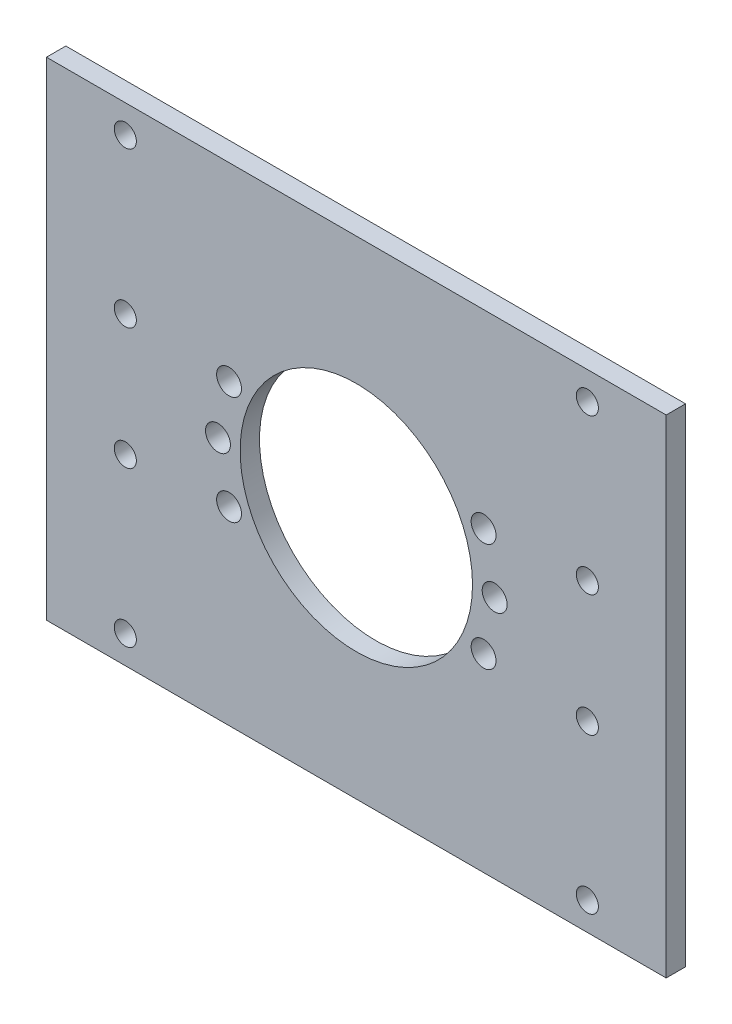
ISO-10303-21;
HEADER;
FILE_DESCRIPTION(('STEP AP214'),'2;1');
FILE_NAME('part.step','',(''),(''),'','','');
FILE_SCHEMA(('AUTOMOTIVE_DESIGN { 1 0 10303 214 1 1 1 1 }'));
ENDSEC;
DATA;
#1=APPLICATION_CONTEXT('core data for automotive mechanical design processes');
#2=APPLICATION_PROTOCOL_DEFINITION('international standard','automotive_design',2000,#1);
#3=PRODUCT_CONTEXT('',#1,'mechanical');
#4=PRODUCT('Part','Part','',(#3));
#5=PRODUCT_RELATED_PRODUCT_CATEGORY('part','',(#4));
#6=PRODUCT_DEFINITION_FORMATION('','',#4);
#7=PRODUCT_DEFINITION_CONTEXT('part definition',#1,'design');
#8=PRODUCT_DEFINITION('design','',#6,#7);
#9=PRODUCT_DEFINITION_SHAPE('','',#8);
#10=(LENGTH_UNIT() NAMED_UNIT(*) SI_UNIT(.MILLI.,.METRE.));
#11=(NAMED_UNIT(*) PLANE_ANGLE_UNIT() SI_UNIT($,.RADIAN.));
#12=(NAMED_UNIT(*) SI_UNIT($,.STERADIAN.) SOLID_ANGLE_UNIT());
#13=UNCERTAINTY_MEASURE_WITH_UNIT(LENGTH_MEASURE(1.E-05),#10,'distance_accuracy_value','');
#14=(GEOMETRIC_REPRESENTATION_CONTEXT(3) GLOBAL_UNCERTAINTY_ASSIGNED_CONTEXT((#13)) GLOBAL_UNIT_ASSIGNED_CONTEXT((#10,
#11,#12)) REPRESENTATION_CONTEXT('',''));
#15=CARTESIAN_POINT('',(0.,0.,0.));
#16=DIRECTION('',(0.,0.,1.));
#17=DIRECTION('',(1.,0.,0.));
#18=AXIS2_PLACEMENT_3D('',#15,#16,#17);
#19=CARTESIAN_POINT('',(-56.,0.,3.5));
#20=DIRECTION('',(-1.,0.,0.));
#21=DIRECTION('',(0.,0.,1.));
#22=AXIS2_PLACEMENT_3D('',#19,#20,#21);
#23=PLANE('',#22);
#24=DIRECTION('',(0.,1.,0.));
#25=VECTOR('',#24,1.);
#26=CARTESIAN_POINT('',(-56.,0.,0.));
#27=LINE('',#26,#25);
#28=CARTESIAN_POINT('',(-56.,-44.06,0.));
#29=VERTEX_POINT('',#28);
#30=CARTESIAN_POINT('',(-56.,44.06,0.));
#31=VERTEX_POINT('',#30);
#32=EDGE_CURVE('E120',#29,#31,#27,.T.);
#33=ORIENTED_EDGE('',*,*,#32,.F.);
#34=DIRECTION('',(0.,0.,-1.));
#35=VECTOR('',#34,1.);
#36=CARTESIAN_POINT('',(-56.,-44.06,3.5));
#37=LINE('',#36,#35);
#38=CARTESIAN_POINT('',(-56.,-44.06,3.5));
#39=VERTEX_POINT('',#38);
#40=EDGE_CURVE('E11',#39,#29,#37,.T.);
#41=ORIENTED_EDGE('',*,*,#40,.F.);
#42=DIRECTION('',(0.,1.,0.));
#43=VECTOR('',#42,1.);
#44=CARTESIAN_POINT('',(-56.,0.,3.5));
#45=LINE('',#44,#43);
#46=CARTESIAN_POINT('',(-56.,44.06,3.5));
#47=VERTEX_POINT('',#46);
#48=EDGE_CURVE('E91',#39,#47,#45,.T.);
#49=ORIENTED_EDGE('',*,*,#48,.T.);
#50=DIRECTION('',(0.,0.,-1.));
#51=VECTOR('',#50,1.);
#52=CARTESIAN_POINT('',(-56.,44.06,3.5));
#53=LINE('',#52,#51);
#54=EDGE_CURVE('E52',#47,#31,#53,.T.);
#55=ORIENTED_EDGE('',*,*,#54,.T.);
#56=EDGE_LOOP('',(#33,#41,#49,#55));
#57=FACE_BOUND('',#56,.T.);
#58=ADVANCED_FACE('F35',(#57),#23,.T.);
#59=CARTESIAN_POINT('',(0.,-44.06,3.5));
#60=DIRECTION('',(0.,1.,0.));
#61=DIRECTION('',(-1.,0.,0.));
#62=AXIS2_PLACEMENT_3D('',#59,#60,#61);
#63=PLANE('',#62);
#64=DIRECTION('',(1.,0.,0.));
#65=VECTOR('',#64,1.);
#66=CARTESIAN_POINT('',(0.,-44.06,0.));
#67=LINE('',#66,#65);
#68=CARTESIAN_POINT('',(56.,-44.06,0.));
#69=VERTEX_POINT('',#68);
#70=EDGE_CURVE('E96',#29,#69,#67,.T.);
#71=ORIENTED_EDGE('',*,*,#70,.T.);
#72=DIRECTION('',(0.,0.,-1.));
#73=VECTOR('',#72,1.);
#74=CARTESIAN_POINT('',(56.,-44.06,3.5));
#75=LINE('',#74,#73);
#76=CARTESIAN_POINT('',(56.,-44.06,3.5));
#77=VERTEX_POINT('',#76);
#78=EDGE_CURVE('E44',#77,#69,#75,.T.);
#79=ORIENTED_EDGE('',*,*,#78,.F.);
#80=DIRECTION('',(1.,0.,0.));
#81=VECTOR('',#80,1.);
#82=CARTESIAN_POINT('',(0.,-44.06,3.5));
#83=LINE('',#82,#81);
#84=EDGE_CURVE('E86',#39,#77,#83,.T.);
#85=ORIENTED_EDGE('',*,*,#84,.F.);
#86=ORIENTED_EDGE('',*,*,#40,.T.);
#87=EDGE_LOOP('',(#71,#79,#85,#86));
#88=FACE_BOUND('',#87,.T.);
#89=ADVANCED_FACE('F94',(#88),#63,.F.);
#90=CARTESIAN_POINT('',(56.,0.,3.5));
#91=DIRECTION('',(-1.,0.,0.));
#92=DIRECTION('',(0.,0.,1.));
#93=AXIS2_PLACEMENT_3D('',#90,#91,#92);
#94=PLANE('',#93);
#95=DIRECTION('',(0.,1.,0.));
#96=VECTOR('',#95,1.);
#97=CARTESIAN_POINT('',(56.,0.,0.));
#98=LINE('',#97,#96);
#99=CARTESIAN_POINT('',(56.,44.06,0.));
#100=VERTEX_POINT('',#99);
#101=EDGE_CURVE('E117',#69,#100,#98,.T.);
#102=ORIENTED_EDGE('',*,*,#101,.T.);
#103=DIRECTION('',(0.,0.,-1.));
#104=VECTOR('',#103,1.);
#105=CARTESIAN_POINT('',(56.,44.06,3.5));
#106=LINE('',#105,#104);
#107=CARTESIAN_POINT('',(56.,44.06,3.5));
#108=VERTEX_POINT('',#107);
#109=EDGE_CURVE('E66',#108,#100,#106,.T.);
#110=ORIENTED_EDGE('',*,*,#109,.F.);
#111=DIRECTION('',(0.,1.,0.));
#112=VECTOR('',#111,1.);
#113=CARTESIAN_POINT('',(56.,0.,3.5));
#114=LINE('',#113,#112);
#115=EDGE_CURVE('E78',#77,#108,#114,.T.);
#116=ORIENTED_EDGE('',*,*,#115,.F.);
#117=ORIENTED_EDGE('',*,*,#78,.T.);
#118=EDGE_LOOP('',(#102,#110,#116,#117));
#119=FACE_BOUND('',#118,.T.);
#120=ADVANCED_FACE('F80',(#119),#94,.F.);
#121=CARTESIAN_POINT('',(23.,-9.79795897113271,3.5));
#122=DIRECTION('',(0.,0.,-1.));
#123=DIRECTION('',(-1.,0.,0.));
#124=AXIS2_PLACEMENT_3D('',#121,#122,#123);
#125=CYLINDRICAL_SURFACE('',#124,2.25);
#126=CARTESIAN_POINT('',(23.,-9.79795897113271,3.5));
#127=DIRECTION('',(0.,0.,1.));
#128=DIRECTION('',(1.,0.,0.));
#129=AXIS2_PLACEMENT_3D('',#126,#127,#128);
#130=CIRCLE('',#129,2.25);
#131=CARTESIAN_POINT('',(25.25,-9.79795897113271,3.5));
#132=VERTEX_POINT('',#131);
#133=EDGE_CURVE('E134',#132,#132,#130,.F.);
#134=ORIENTED_EDGE('',*,*,#133,.F.);
#135=EDGE_LOOP('',(#134));
#136=FACE_BOUND('',#135,.T.);
#137=CARTESIAN_POINT('',(23.,-9.79795897113271,0.));
#138=DIRECTION('',(0.,0.,1.));
#139=DIRECTION('',(1.,0.,0.));
#140=AXIS2_PLACEMENT_3D('',#137,#138,#139);
#141=CIRCLE('',#140,2.25);
#142=CARTESIAN_POINT('',(25.25,-9.79795897113271,0.));
#143=VERTEX_POINT('',#142);
#144=EDGE_CURVE('E105',#143,#143,#141,.F.);
#145=ORIENTED_EDGE('',*,*,#144,.T.);
#146=EDGE_LOOP('',(#145));
#147=FACE_BOUND('',#146,.T.);
#148=ADVANCED_FACE('F443',(#136,#147),#125,.F.);
#149=CARTESIAN_POINT('',(25.,0.,3.5));
#150=DIRECTION('',(0.,0.,-1.));
#151=DIRECTION('',(-1.,0.,0.));
#152=AXIS2_PLACEMENT_3D('',#149,#150,#151);
#153=CYLINDRICAL_SURFACE('',#152,2.25);
#154=CARTESIAN_POINT('',(25.,0.,3.5));
#155=DIRECTION('',(0.,0.,1.));
#156=DIRECTION('',(1.,0.,0.));
#157=AXIS2_PLACEMENT_3D('',#154,#155,#156);
#158=CIRCLE('',#157,2.25);
#159=CARTESIAN_POINT('',(27.25,0.,3.5));
#160=VERTEX_POINT('',#159);
#161=EDGE_CURVE('E137',#160,#160,#158,.T.);
#162=ORIENTED_EDGE('',*,*,#161,.T.);
#163=EDGE_LOOP('',(#162));
#164=FACE_BOUND('',#163,.T.);
#165=CARTESIAN_POINT('',(25.,0.,0.));
#166=DIRECTION('',(0.,0.,1.));
#167=DIRECTION('',(1.,0.,0.));
#168=AXIS2_PLACEMENT_3D('',#165,#166,#167);
#169=CIRCLE('',#168,2.25);
#170=CARTESIAN_POINT('',(27.25,0.,0.));
#171=VERTEX_POINT('',#170);
#172=EDGE_CURVE('E108',#171,#171,#169,.T.);
#173=ORIENTED_EDGE('',*,*,#172,.F.);
#174=EDGE_LOOP('',(#173));
#175=FACE_BOUND('',#174,.T.);
#176=ADVANCED_FACE('F434',(#164,#175),#153,.F.);
#177=CARTESIAN_POINT('',(0.,0.,3.5));
#178=DIRECTION('',(0.,0.,-1.));
#179=DIRECTION('',(-1.,0.,0.));
#180=AXIS2_PLACEMENT_3D('',#177,#178,#179);
#181=CYLINDRICAL_SURFACE('',#180,21.);
#182=CARTESIAN_POINT('',(0.,0.,3.5));
#183=DIRECTION('',(0.,0.,1.));
#184=DIRECTION('',(1.,0.,0.));
#185=AXIS2_PLACEMENT_3D('',#182,#183,#184);
#186=CIRCLE('',#185,21.);
#187=CARTESIAN_POINT('',(21.,0.,3.5));
#188=VERTEX_POINT('',#187);
#189=EDGE_CURVE('E140',#188,#188,#186,.T.);
#190=ORIENTED_EDGE('',*,*,#189,.T.);
#191=EDGE_LOOP('',(#190));
#192=FACE_BOUND('',#191,.T.);
#193=CARTESIAN_POINT('',(0.,0.,0.));
#194=DIRECTION('',(0.,0.,1.));
#195=DIRECTION('',(1.,0.,0.));
#196=AXIS2_PLACEMENT_3D('',#193,#194,#195);
#197=CIRCLE('',#196,21.);
#198=CARTESIAN_POINT('',(21.,0.,0.));
#199=VERTEX_POINT('',#198);
#200=EDGE_CURVE('E111',#199,#199,#197,.T.);
#201=ORIENTED_EDGE('',*,*,#200,.F.);
#202=EDGE_LOOP('',(#201));
#203=FACE_BOUND('',#202,.T.);
#204=ADVANCED_FACE('F426',(#192,#203),#181,.F.);
#205=CARTESIAN_POINT('',(0.,44.06,3.5));
#206=DIRECTION('',(0.,1.,0.));
#207=DIRECTION('',(0.,0.,1.));
#208=AXIS2_PLACEMENT_3D('',#205,#206,#207);
#209=PLANE('',#208);
#210=DIRECTION('',(1.,0.,0.));
#211=VECTOR('',#210,1.);
#212=CARTESIAN_POINT('',(0.,44.06,0.));
#213=LINE('',#212,#211);
#214=EDGE_CURVE('E114',#31,#100,#213,.T.);
#215=ORIENTED_EDGE('',*,*,#214,.F.);
#216=ORIENTED_EDGE('',*,*,#54,.F.);
#217=DIRECTION('',(1.,0.,0.));
#218=VECTOR('',#217,1.);
#219=CARTESIAN_POINT('',(0.,44.06,3.5));
#220=LINE('',#219,#218);
#221=EDGE_CURVE('E85',#47,#108,#220,.T.);
#222=ORIENTED_EDGE('',*,*,#221,.T.);
#223=ORIENTED_EDGE('',*,*,#109,.T.);
#224=EDGE_LOOP('',(#215,#216,#222,#223));
#225=FACE_BOUND('',#224,.T.);
#226=ADVANCED_FACE('F239',(#225),#209,.T.);
#227=CARTESIAN_POINT('',(-23.,9.79795897113272,3.5));
#228=DIRECTION('',(0.,0.,-1.));
#229=DIRECTION('',(-1.,0.,0.));
#230=AXIS2_PLACEMENT_3D('',#227,#228,#229);
#231=CYLINDRICAL_SURFACE('',#230,2.25);
#232=CARTESIAN_POINT('',(-23.,9.79795897113272,3.5));
#233=DIRECTION('',(0.,0.,1.));
#234=DIRECTION('',(1.,0.,0.));
#235=AXIS2_PLACEMENT_3D('',#232,#233,#234);
#236=CIRCLE('',#235,2.25);
#237=CARTESIAN_POINT('',(-20.75,9.79795897113272,3.5));
#238=VERTEX_POINT('',#237);
#239=EDGE_CURVE('E145',#238,#238,#236,.F.);
#240=ORIENTED_EDGE('',*,*,#239,.F.);
#241=EDGE_LOOP('',(#240));
#242=FACE_BOUND('',#241,.T.);
#243=CARTESIAN_POINT('',(-23.,9.79795897113272,0.));
#244=DIRECTION('',(0.,0.,1.));
#245=DIRECTION('',(1.,0.,0.));
#246=AXIS2_PLACEMENT_3D('',#243,#244,#245);
#247=CIRCLE('',#246,2.25);
#248=CARTESIAN_POINT('',(-20.75,9.79795897113272,0.));
#249=VERTEX_POINT('',#248);
#250=EDGE_CURVE('E122',#249,#249,#247,.F.);
#251=ORIENTED_EDGE('',*,*,#250,.T.);
#252=EDGE_LOOP('',(#251));
#253=FACE_BOUND('',#252,.T.);
#254=ADVANCED_FACE('F235',(#242,#253),#231,.F.);
#255=CARTESIAN_POINT('',(-23.,-9.7979589711327,3.5));
#256=DIRECTION('',(0.,0.,-1.));
#257=DIRECTION('',(-1.,0.,0.));
#258=AXIS2_PLACEMENT_3D('',#255,#256,#257);
#259=CYLINDRICAL_SURFACE('',#258,2.25);
#260=CARTESIAN_POINT('',(-23.,-9.7979589711327,3.5));
#261=DIRECTION('',(0.,0.,1.));
#262=DIRECTION('',(1.,0.,0.));
#263=AXIS2_PLACEMENT_3D('',#260,#261,#262);
#264=CIRCLE('',#263,2.25);
#265=CARTESIAN_POINT('',(-20.75,-9.7979589711327,3.5));
#266=VERTEX_POINT('',#265);
#267=EDGE_CURVE('E148',#266,#266,#264,.T.);
#268=ORIENTED_EDGE('',*,*,#267,.T.);
#269=EDGE_LOOP('',(#268));
#270=FACE_BOUND('',#269,.T.);
#271=CARTESIAN_POINT('',(-23.,-9.7979589711327,0.));
#272=DIRECTION('',(0.,0.,1.));
#273=DIRECTION('',(1.,0.,0.));
#274=AXIS2_PLACEMENT_3D('',#271,#272,#273);
#275=CIRCLE('',#274,2.25);
#276=CARTESIAN_POINT('',(-20.75,-9.7979589711327,0.));
#277=VERTEX_POINT('',#276);
#278=EDGE_CURVE('E125',#277,#277,#275,.T.);
#279=ORIENTED_EDGE('',*,*,#278,.F.);
#280=EDGE_LOOP('',(#279));
#281=FACE_BOUND('',#280,.T.);
#282=ADVANCED_FACE('F238',(#270,#281),#259,.F.);
#283=CARTESIAN_POINT('',(23.,9.79795897113271,3.5));
#284=DIRECTION('',(0.,0.,-1.));
#285=DIRECTION('',(-1.,0.,0.));
#286=AXIS2_PLACEMENT_3D('',#283,#284,#285);
#287=CYLINDRICAL_SURFACE('',#286,2.25);
#288=CARTESIAN_POINT('',(23.,9.79795897113271,3.5));
#289=DIRECTION('',(0.,0.,1.));
#290=DIRECTION('',(1.,0.,0.));
#291=AXIS2_PLACEMENT_3D('',#288,#289,#290);
#292=CIRCLE('',#291,2.25);
#293=CARTESIAN_POINT('',(25.25,9.79795897113271,3.5));
#294=VERTEX_POINT('',#293);
#295=EDGE_CURVE('E104',#294,#294,#292,.T.);
#296=ORIENTED_EDGE('',*,*,#295,.T.);
#297=EDGE_LOOP('',(#296));
#298=FACE_BOUND('',#297,.T.);
#299=CARTESIAN_POINT('',(23.,9.79795897113271,0.));
#300=DIRECTION('',(0.,0.,1.));
#301=DIRECTION('',(1.,0.,0.));
#302=AXIS2_PLACEMENT_3D('',#299,#300,#301);
#303=CIRCLE('',#302,2.25);
#304=CARTESIAN_POINT('',(25.25,9.79795897113271,0.));
#305=VERTEX_POINT('',#304);
#306=EDGE_CURVE('E128',#305,#305,#303,.T.);
#307=ORIENTED_EDGE('',*,*,#306,.F.);
#308=EDGE_LOOP('',(#307));
#309=FACE_BOUND('',#308,.T.);
#310=ADVANCED_FACE('F37',(#298,#309),#287,.F.);
#311=CARTESIAN_POINT('',(-25.,0.,3.5));
#312=DIRECTION('',(0.,0.,-1.));
#313=DIRECTION('',(-1.,0.,0.));
#314=AXIS2_PLACEMENT_3D('',#311,#312,#313);
#315=CYLINDRICAL_SURFACE('',#314,2.25);
#316=CARTESIAN_POINT('',(-25.,0.,3.5));
#317=DIRECTION('',(0.,0.,1.));
#318=DIRECTION('',(1.,0.,0.));
#319=AXIS2_PLACEMENT_3D('',#316,#317,#318);
#320=CIRCLE('',#319,2.25);
#321=CARTESIAN_POINT('',(-22.75,0.,3.5));
#322=VERTEX_POINT('',#321);
#323=EDGE_CURVE('E100',#322,#322,#320,.F.);
#324=ORIENTED_EDGE('',*,*,#323,.F.);
#325=EDGE_LOOP('',(#324));
#326=FACE_BOUND('',#325,.T.);
#327=CARTESIAN_POINT('',(-25.,0.,0.));
#328=DIRECTION('',(0.,0.,1.));
#329=DIRECTION('',(1.,0.,0.));
#330=AXIS2_PLACEMENT_3D('',#327,#328,#329);
#331=CIRCLE('',#330,2.25);
#332=CARTESIAN_POINT('',(-22.75,0.,0.));
#333=VERTEX_POINT('',#332);
#334=EDGE_CURVE('E101',#333,#333,#331,.F.);
#335=ORIENTED_EDGE('',*,*,#334,.T.);
#336=EDGE_LOOP('',(#335));
#337=FACE_BOUND('',#336,.T.);
#338=ADVANCED_FACE('F213',(#326,#337),#315,.F.);
#339=CARTESIAN_POINT('',(0.,0.,3.5));
#340=DIRECTION('',(0.,0.,1.));
#341=DIRECTION('',(1.,0.,0.));
#342=AXIS2_PLACEMENT_3D('',#339,#340,#341);
#343=PLANE('',#342);
#344=CARTESIAN_POINT('',(-41.7499999517118,-10.9978220350817,3.5));
#345=DIRECTION('',(0.,0.,1.));
#346=DIRECTION('',(1.,0.,0.));
#347=AXIS2_PLACEMENT_3D('',#344,#345,#346);
#348=CIRCLE('',#347,1.99784914999465);
#349=CARTESIAN_POINT('',(-39.7521508017171,-10.9978220350817,3.5));
#350=VERTEX_POINT('',#349);
#351=EDGE_CURVE('E195',#350,#350,#348,.T.);
#352=ORIENTED_EDGE('',*,*,#351,.F.);
#353=EDGE_LOOP('',(#352));
#354=FACE_BOUND('',#353,.T.);
#355=CARTESIAN_POINT('',(-41.7499998567938,-38.9978219593871,3.5));
#356=DIRECTION('',(0.,0.,1.));
#357=DIRECTION('',(1.,0.,0.));
#358=AXIS2_PLACEMENT_3D('',#355,#356,#357);
#359=CIRCLE('',#358,1.99784904061286);
#360=CARTESIAN_POINT('',(-39.7521508161809,-38.9978219593871,3.5));
#361=VERTEX_POINT('',#360);
#362=EDGE_CURVE('E189',#361,#361,#359,.T.);
#363=ORIENTED_EDGE('',*,*,#362,.F.);
#364=EDGE_LOOP('',(#363));
#365=FACE_BOUND('',#364,.T.);
#366=CARTESIAN_POINT('',(41.75,-38.9978220034269,3.5));
#367=DIRECTION('',(0.,0.,1.));
#368=DIRECTION('',(1.,0.,0.));
#369=AXIS2_PLACEMENT_3D('',#366,#367,#368);
#370=CIRCLE('',#369,1.9978491362511);
#371=CARTESIAN_POINT('',(43.7478491362511,-38.9978220034269,3.5));
#372=VERTEX_POINT('',#371);
#373=EDGE_CURVE('E183',#372,#372,#370,.T.);
#374=ORIENTED_EDGE('',*,*,#373,.F.);
#375=EDGE_LOOP('',(#374));
#376=FACE_BOUND('',#375,.T.);
#377=CARTESIAN_POINT('',(41.75,-10.9978220034269,3.5));
#378=DIRECTION('',(0.,0.,1.));
#379=DIRECTION('',(1.,0.,0.));
#380=AXIS2_PLACEMENT_3D('',#377,#378,#379);
#381=CIRCLE('',#380,1.9978491362511);
#382=CARTESIAN_POINT('',(43.7478491362511,-10.9978220034269,3.5));
#383=VERTEX_POINT('',#382);
#384=EDGE_CURVE('E177',#383,#383,#381,.T.);
#385=ORIENTED_EDGE('',*,*,#384,.F.);
#386=EDGE_LOOP('',(#385));
#387=FACE_BOUND('',#386,.T.);
#388=CARTESIAN_POINT('',(41.7500000334165,10.9978219957998,3.5));
#389=DIRECTION('',(0.,0.,1.));
#390=DIRECTION('',(1.,0.,0.));
#391=AXIS2_PLACEMENT_3D('',#388,#389,#390);
#392=CIRCLE('',#391,1.99784915762175);
#393=CARTESIAN_POINT('',(43.7478491910383,10.9978219957998,3.5));
#394=VERTEX_POINT('',#393);
#395=EDGE_CURVE('E171',#394,#394,#392,.T.);
#396=ORIENTED_EDGE('',*,*,#395,.F.);
#397=EDGE_LOOP('',(#396));
#398=FACE_BOUND('',#397,.T.);
#399=CARTESIAN_POINT('',(-41.7499999665835,39.0021779957998,3.5));
#400=DIRECTION('',(0.,0.,1.));
#401=DIRECTION('',(1.,0.,0.));
#402=AXIS2_PLACEMENT_3D('',#399,#400,#401);
#403=CIRCLE('',#402,1.99784915762175);
#404=CARTESIAN_POINT('',(-39.7521508089618,39.0021779957998,3.5));
#405=VERTEX_POINT('',#404);
#406=EDGE_CURVE('E165',#405,#405,#403,.T.);
#407=ORIENTED_EDGE('',*,*,#406,.F.);
#408=EDGE_LOOP('',(#407));
#409=FACE_BOUND('',#408,.T.);
#410=CARTESIAN_POINT('',(41.7500000334165,38.9978219957998,3.5));
#411=DIRECTION('',(0.,0.,1.));
#412=DIRECTION('',(1.,0.,0.));
#413=AXIS2_PLACEMENT_3D('',#410,#411,#412);
#414=CIRCLE('',#413,1.99784915762175);
#415=CARTESIAN_POINT('',(43.7478491910383,38.9978219957998,3.5));
#416=VERTEX_POINT('',#415);
#417=EDGE_CURVE('E159',#416,#416,#414,.T.);
#418=ORIENTED_EDGE('',*,*,#417,.F.);
#419=EDGE_LOOP('',(#418));
#420=FACE_BOUND('',#419,.T.);
#421=CARTESIAN_POINT('',(-41.7499999665835,11.0021779957998,3.5));
#422=DIRECTION('',(0.,0.,1.));
#423=DIRECTION('',(1.,0.,0.));
#424=AXIS2_PLACEMENT_3D('',#421,#422,#423);
#425=CIRCLE('',#424,1.99784915762175);
#426=CARTESIAN_POINT('',(-39.7521508089618,11.0021779957998,3.5));
#427=VERTEX_POINT('',#426);
#428=EDGE_CURVE('E153',#427,#427,#425,.T.);
#429=ORIENTED_EDGE('',*,*,#428,.F.);
#430=EDGE_LOOP('',(#429));
#431=FACE_BOUND('',#430,.T.);
#432=ORIENTED_EDGE('',*,*,#295,.F.);
#433=EDGE_LOOP('',(#432));
#434=FACE_BOUND('',#433,.T.);
#435=ORIENTED_EDGE('',*,*,#267,.F.);
#436=EDGE_LOOP('',(#435));
#437=FACE_BOUND('',#436,.T.);
#438=ORIENTED_EDGE('',*,*,#239,.T.);
#439=EDGE_LOOP('',(#438));
#440=FACE_BOUND('',#439,.T.);
#441=ORIENTED_EDGE('',*,*,#48,.F.);
#442=ORIENTED_EDGE('',*,*,#84,.T.);
#443=ORIENTED_EDGE('',*,*,#115,.T.);
#444=ORIENTED_EDGE('',*,*,#221,.F.);
#445=EDGE_LOOP('',(#441,#442,#443,#444));
#446=FACE_BOUND('',#445,.T.);
#447=ORIENTED_EDGE('',*,*,#189,.F.);
#448=EDGE_LOOP('',(#447));
#449=FACE_BOUND('',#448,.T.);
#450=ORIENTED_EDGE('',*,*,#161,.F.);
#451=EDGE_LOOP('',(#450));
#452=FACE_BOUND('',#451,.T.);
#453=ORIENTED_EDGE('',*,*,#133,.T.);
#454=EDGE_LOOP('',(#453));
#455=FACE_BOUND('',#454,.T.);
#456=ORIENTED_EDGE('',*,*,#323,.T.);
#457=EDGE_LOOP('',(#456));
#458=FACE_BOUND('',#457,.T.);
#459=ADVANCED_FACE('F89',(#354,#365,#376,#387,#398,#409,#420,#431,#434,#437,#440,#446,#449,#452,
#455,#458),#343,.T.);
#460=CARTESIAN_POINT('',(0.,0.,0.));
#461=DIRECTION('',(0.,0.,1.));
#462=DIRECTION('',(1.,0.,0.));
#463=AXIS2_PLACEMENT_3D('',#460,#461,#462);
#464=PLANE('',#463);
#465=CARTESIAN_POINT('',(-41.7499999517118,-10.9978220350817,0.));
#466=DIRECTION('',(0.,0.,1.));
#467=DIRECTION('',(1.,0.,0.));
#468=AXIS2_PLACEMENT_3D('',#465,#466,#467);
#469=CIRCLE('',#468,1.99784914999465);
#470=CARTESIAN_POINT('',(-39.7521508017171,-10.9978220350817,0.));
#471=VERTEX_POINT('',#470);
#472=EDGE_CURVE('E192',#471,#471,#469,.T.);
#473=ORIENTED_EDGE('',*,*,#472,.T.);
#474=EDGE_LOOP('',(#473));
#475=FACE_BOUND('',#474,.T.);
#476=CARTESIAN_POINT('',(-41.7499998567938,-38.9978219593871,0.));
#477=DIRECTION('',(0.,0.,1.));
#478=DIRECTION('',(1.,0.,0.));
#479=AXIS2_PLACEMENT_3D('',#476,#477,#478);
#480=CIRCLE('',#479,1.99784904061286);
#481=CARTESIAN_POINT('',(-39.7521508161809,-38.9978219593871,0.));
#482=VERTEX_POINT('',#481);
#483=EDGE_CURVE('E186',#482,#482,#480,.T.);
#484=ORIENTED_EDGE('',*,*,#483,.T.);
#485=EDGE_LOOP('',(#484));
#486=FACE_BOUND('',#485,.T.);
#487=CARTESIAN_POINT('',(41.75,-38.9978220034269,0.));
#488=DIRECTION('',(0.,0.,1.));
#489=DIRECTION('',(1.,0.,0.));
#490=AXIS2_PLACEMENT_3D('',#487,#488,#489);
#491=CIRCLE('',#490,1.9978491362511);
#492=CARTESIAN_POINT('',(43.7478491362511,-38.9978220034269,0.));
#493=VERTEX_POINT('',#492);
#494=EDGE_CURVE('E180',#493,#493,#491,.T.);
#495=ORIENTED_EDGE('',*,*,#494,.T.);
#496=EDGE_LOOP('',(#495));
#497=FACE_BOUND('',#496,.T.);
#498=CARTESIAN_POINT('',(41.75,-10.9978220034269,0.));
#499=DIRECTION('',(0.,0.,1.));
#500=DIRECTION('',(1.,0.,0.));
#501=AXIS2_PLACEMENT_3D('',#498,#499,#500);
#502=CIRCLE('',#501,1.9978491362511);
#503=CARTESIAN_POINT('',(43.7478491362511,-10.9978220034269,0.));
#504=VERTEX_POINT('',#503);
#505=EDGE_CURVE('E174',#504,#504,#502,.T.);
#506=ORIENTED_EDGE('',*,*,#505,.T.);
#507=EDGE_LOOP('',(#506));
#508=FACE_BOUND('',#507,.T.);
#509=CARTESIAN_POINT('',(41.7500000334165,10.9978219957998,0.));
#510=DIRECTION('',(0.,0.,1.));
#511=DIRECTION('',(1.,0.,0.));
#512=AXIS2_PLACEMENT_3D('',#509,#510,#511);
#513=CIRCLE('',#512,1.99784915762175);
#514=CARTESIAN_POINT('',(43.7478491910383,10.9978219957998,0.));
#515=VERTEX_POINT('',#514);
#516=EDGE_CURVE('E168',#515,#515,#513,.T.);
#517=ORIENTED_EDGE('',*,*,#516,.T.);
#518=EDGE_LOOP('',(#517));
#519=FACE_BOUND('',#518,.T.);
#520=CARTESIAN_POINT('',(-41.7499999665835,39.0021779957998,0.));
#521=DIRECTION('',(0.,0.,1.));
#522=DIRECTION('',(1.,0.,0.));
#523=AXIS2_PLACEMENT_3D('',#520,#521,#522);
#524=CIRCLE('',#523,1.99784915762175);
#525=CARTESIAN_POINT('',(-39.7521508089618,39.0021779957998,0.));
#526=VERTEX_POINT('',#525);
#527=EDGE_CURVE('E162',#526,#526,#524,.T.);
#528=ORIENTED_EDGE('',*,*,#527,.T.);
#529=EDGE_LOOP('',(#528));
#530=FACE_BOUND('',#529,.T.);
#531=CARTESIAN_POINT('',(41.7500000334165,38.9978219957998,0.));
#532=DIRECTION('',(0.,0.,1.));
#533=DIRECTION('',(1.,0.,0.));
#534=AXIS2_PLACEMENT_3D('',#531,#532,#533);
#535=CIRCLE('',#534,1.99784915762175);
#536=CARTESIAN_POINT('',(43.7478491910383,38.9978219957998,0.));
#537=VERTEX_POINT('',#536);
#538=EDGE_CURVE('E156',#537,#537,#535,.T.);
#539=ORIENTED_EDGE('',*,*,#538,.T.);
#540=EDGE_LOOP('',(#539));
#541=FACE_BOUND('',#540,.T.);
#542=CARTESIAN_POINT('',(-41.7499999665835,11.0021779957998,0.));
#543=DIRECTION('',(0.,0.,1.));
#544=DIRECTION('',(1.,0.,0.));
#545=AXIS2_PLACEMENT_3D('',#542,#543,#544);
#546=CIRCLE('',#545,1.99784915762175);
#547=CARTESIAN_POINT('',(-39.7521508089618,11.0021779957998,0.));
#548=VERTEX_POINT('',#547);
#549=EDGE_CURVE('E131',#548,#548,#546,.T.);
#550=ORIENTED_EDGE('',*,*,#549,.T.);
#551=EDGE_LOOP('',(#550));
#552=FACE_BOUND('',#551,.T.);
#553=ORIENTED_EDGE('',*,*,#306,.T.);
#554=EDGE_LOOP('',(#553));
#555=FACE_BOUND('',#554,.T.);
#556=ORIENTED_EDGE('',*,*,#278,.T.);
#557=EDGE_LOOP('',(#556));
#558=FACE_BOUND('',#557,.T.);
#559=ORIENTED_EDGE('',*,*,#250,.F.);
#560=EDGE_LOOP('',(#559));
#561=FACE_BOUND('',#560,.T.);
#562=ORIENTED_EDGE('',*,*,#32,.T.);
#563=ORIENTED_EDGE('',*,*,#214,.T.);
#564=ORIENTED_EDGE('',*,*,#101,.F.);
#565=ORIENTED_EDGE('',*,*,#70,.F.);
#566=EDGE_LOOP('',(#562,#563,#564,#565));
#567=FACE_BOUND('',#566,.T.);
#568=ORIENTED_EDGE('',*,*,#200,.T.);
#569=EDGE_LOOP('',(#568));
#570=FACE_BOUND('',#569,.T.);
#571=ORIENTED_EDGE('',*,*,#172,.T.);
#572=EDGE_LOOP('',(#571));
#573=FACE_BOUND('',#572,.T.);
#574=ORIENTED_EDGE('',*,*,#144,.F.);
#575=EDGE_LOOP('',(#574));
#576=FACE_BOUND('',#575,.T.);
#577=ORIENTED_EDGE('',*,*,#334,.F.);
#578=EDGE_LOOP('',(#577));
#579=FACE_BOUND('',#578,.T.);
#580=ADVANCED_FACE('F201',(#475,#486,#497,#508,#519,#530,#541,#552,#555,#558,#561,#567,#570,
#573,#576,#579),#464,.F.);
#581=CARTESIAN_POINT('',(-41.7499999665835,11.0021779957998,0.));
#582=DIRECTION('',(0.,0.,1.));
#583=DIRECTION('',(1.,0.,0.));
#584=AXIS2_PLACEMENT_3D('',#581,#582,#583);
#585=CYLINDRICAL_SURFACE('',#584,1.99784915762175);
#586=ORIENTED_EDGE('',*,*,#549,.F.);
#587=EDGE_LOOP('',(#586));
#588=FACE_BOUND('',#587,.T.);
#589=ORIENTED_EDGE('',*,*,#428,.T.);
#590=EDGE_LOOP('',(#589));
#591=FACE_BOUND('',#590,.T.);
#592=ADVANCED_FACE('F245',(#588,#591),#585,.F.);
#593=CARTESIAN_POINT('',(41.7500000334165,38.9978219957998,0.));
#594=DIRECTION('',(0.,0.,1.));
#595=DIRECTION('',(1.,0.,0.));
#596=AXIS2_PLACEMENT_3D('',#593,#594,#595);
#597=CYLINDRICAL_SURFACE('',#596,1.99784915762175);
#598=ORIENTED_EDGE('',*,*,#538,.F.);
#599=EDGE_LOOP('',(#598));
#600=FACE_BOUND('',#599,.T.);
#601=ORIENTED_EDGE('',*,*,#417,.T.);
#602=EDGE_LOOP('',(#601));
#603=FACE_BOUND('',#602,.T.);
#604=ADVANCED_FACE('F308',(#600,#603),#597,.F.);
#605=CARTESIAN_POINT('',(-41.7499999665835,39.0021779957998,0.));
#606=DIRECTION('',(0.,0.,1.));
#607=DIRECTION('',(1.,0.,0.));
#608=AXIS2_PLACEMENT_3D('',#605,#606,#607);
#609=CYLINDRICAL_SURFACE('',#608,1.99784915762175);
#610=ORIENTED_EDGE('',*,*,#527,.F.);
#611=EDGE_LOOP('',(#610));
#612=FACE_BOUND('',#611,.T.);
#613=ORIENTED_EDGE('',*,*,#406,.T.);
#614=EDGE_LOOP('',(#613));
#615=FACE_BOUND('',#614,.T.);
#616=ADVANCED_FACE('F318',(#612,#615),#609,.F.);
#617=CARTESIAN_POINT('',(41.7500000334165,10.9978219957998,0.));
#618=DIRECTION('',(0.,0.,1.));
#619=DIRECTION('',(1.,0.,0.));
#620=AXIS2_PLACEMENT_3D('',#617,#618,#619);
#621=CYLINDRICAL_SURFACE('',#620,1.99784915762175);
#622=ORIENTED_EDGE('',*,*,#516,.F.);
#623=EDGE_LOOP('',(#622));
#624=FACE_BOUND('',#623,.T.);
#625=ORIENTED_EDGE('',*,*,#395,.T.);
#626=EDGE_LOOP('',(#625));
#627=FACE_BOUND('',#626,.T.);
#628=ADVANCED_FACE('F328',(#624,#627),#621,.F.);
#629=CARTESIAN_POINT('',(41.75,-10.9978220034269,0.));
#630=DIRECTION('',(0.,0.,1.));
#631=DIRECTION('',(1.,0.,0.));
#632=AXIS2_PLACEMENT_3D('',#629,#630,#631);
#633=CYLINDRICAL_SURFACE('',#632,1.9978491362511);
#634=ORIENTED_EDGE('',*,*,#505,.F.);
#635=EDGE_LOOP('',(#634));
#636=FACE_BOUND('',#635,.T.);
#637=ORIENTED_EDGE('',*,*,#384,.T.);
#638=EDGE_LOOP('',(#637));
#639=FACE_BOUND('',#638,.T.);
#640=ADVANCED_FACE('F338',(#636,#639),#633,.F.);
#641=CARTESIAN_POINT('',(41.75,-38.9978220034269,0.));
#642=DIRECTION('',(0.,0.,1.));
#643=DIRECTION('',(1.,0.,0.));
#644=AXIS2_PLACEMENT_3D('',#641,#642,#643);
#645=CYLINDRICAL_SURFACE('',#644,1.9978491362511);
#646=ORIENTED_EDGE('',*,*,#494,.F.);
#647=EDGE_LOOP('',(#646));
#648=FACE_BOUND('',#647,.T.);
#649=ORIENTED_EDGE('',*,*,#373,.T.);
#650=EDGE_LOOP('',(#649));
#651=FACE_BOUND('',#650,.T.);
#652=ADVANCED_FACE('F348',(#648,#651),#645,.F.);
#653=CARTESIAN_POINT('',(-41.7499998567938,-38.9978219593871,0.));
#654=DIRECTION('',(0.,0.,1.));
#655=DIRECTION('',(1.,0.,0.));
#656=AXIS2_PLACEMENT_3D('',#653,#654,#655);
#657=CYLINDRICAL_SURFACE('',#656,1.99784904061286);
#658=ORIENTED_EDGE('',*,*,#483,.F.);
#659=EDGE_LOOP('',(#658));
#660=FACE_BOUND('',#659,.T.);
#661=ORIENTED_EDGE('',*,*,#362,.T.);
#662=EDGE_LOOP('',(#661));
#663=FACE_BOUND('',#662,.T.);
#664=ADVANCED_FACE('F207',(#660,#663),#657,.F.);
#665=CARTESIAN_POINT('',(-41.7499999517118,-10.9978220350817,0.));
#666=DIRECTION('',(0.,0.,1.));
#667=DIRECTION('',(1.,0.,0.));
#668=AXIS2_PLACEMENT_3D('',#665,#666,#667);
#669=CYLINDRICAL_SURFACE('',#668,1.99784914999465);
#670=ORIENTED_EDGE('',*,*,#472,.F.);
#671=EDGE_LOOP('',(#670));
#672=FACE_BOUND('',#671,.T.);
#673=ORIENTED_EDGE('',*,*,#351,.T.);
#674=EDGE_LOOP('',(#673));
#675=FACE_BOUND('',#674,.T.);
#676=ADVANCED_FACE('F204',(#672,#675),#669,.F.);
#677=CLOSED_SHELL('',(#58,#89,#120,#148,#176,#204,#226,#254,#282,#310,#338,#459,#580,#592,#604,
#616,#628,#640,#652,#664,#676));
#678=MANIFOLD_SOLID_BREP('B2',#677);
#679=ADVANCED_BREP_SHAPE_REPRESENTATION('',(#18,#678),#14);
#680=SHAPE_DEFINITION_REPRESENTATION(#9,#679);
ENDSEC;
END-ISO-10303-21;
